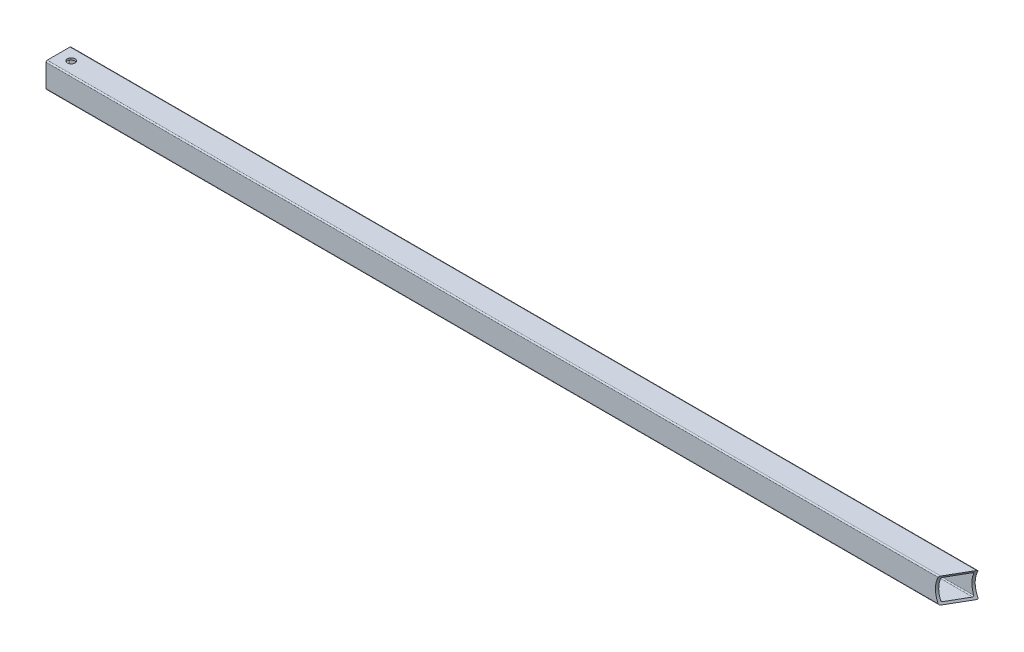
ISO-10303-21;
HEADER;
FILE_DESCRIPTION(('STEP AP214'),'2;1');
FILE_NAME('part.step','',(''),(''),'','','');
FILE_SCHEMA(('AUTOMOTIVE_DESIGN { 1 0 10303 214 1 1 1 1 }'));
ENDSEC;
DATA;
#1=APPLICATION_CONTEXT('core data for automotive mechanical design processes');
#2=APPLICATION_PROTOCOL_DEFINITION('international standard','automotive_design',2000,#1);
#3=PRODUCT_CONTEXT('',#1,'mechanical');
#4=PRODUCT('Part','Part','',(#3));
#5=PRODUCT_RELATED_PRODUCT_CATEGORY('part','',(#4));
#6=PRODUCT_DEFINITION_FORMATION('','',#4);
#7=PRODUCT_DEFINITION_CONTEXT('part definition',#1,'design');
#8=PRODUCT_DEFINITION('design','',#6,#7);
#9=PRODUCT_DEFINITION_SHAPE('','',#8);
#10=(LENGTH_UNIT() NAMED_UNIT(*) SI_UNIT(.MILLI.,.METRE.));
#11=(NAMED_UNIT(*) PLANE_ANGLE_UNIT() SI_UNIT($,.RADIAN.));
#12=(NAMED_UNIT(*) SI_UNIT($,.STERADIAN.) SOLID_ANGLE_UNIT());
#13=UNCERTAINTY_MEASURE_WITH_UNIT(LENGTH_MEASURE(1.E-05),#10,'distance_accuracy_value','');
#14=(GEOMETRIC_REPRESENTATION_CONTEXT(3) GLOBAL_UNCERTAINTY_ASSIGNED_CONTEXT((#13)) GLOBAL_UNIT_ASSIGNED_CONTEXT((#10,
#11,#12)) REPRESENTATION_CONTEXT('',''));
#15=CARTESIAN_POINT('',(0.,0.,0.));
#16=DIRECTION('',(0.,0.,1.));
#17=DIRECTION('',(1.,0.,0.));
#18=AXIS2_PLACEMENT_3D('',#15,#16,#17);
#19=CARTESIAN_POINT('',(457.2,-11.43,-11.43));
#20=DIRECTION('',(-1.,0.,0.));
#21=DIRECTION('',(0.,0.,1.));
#22=AXIS2_PLACEMENT_3D('',#19,#20,#21);
#23=CYLINDRICAL_SURFACE('',#22,1.27);
#24=DIRECTION('',(-1.,0.,0.));
#25=VECTOR('',#24,1.);
#26=CARTESIAN_POINT('',(457.2,-11.43,-12.7));
#27=LINE('',#26,#25);
#28=CARTESIAN_POINT('',(456.516703940509,-11.43,-12.7));
#29=VERTEX_POINT('',#28);
#30=CARTESIAN_POINT('',(-457.2,-11.43,-12.7));
#31=VERTEX_POINT('',#30);
#32=EDGE_CURVE('E11',#29,#31,#27,.T.);
#33=ORIENTED_EDGE('',*,*,#32,.F.);
#34=CARTESIAN_POINT('',(456.51670394051,-11.43,-12.7));
#35=CARTESIAN_POINT('',(456.548055928662,-11.4921896979992,-12.7000400487077));
#36=CARTESIAN_POINT('',(456.577605739151,-11.5554827073413,-12.6954281215397));
#37=CARTESIAN_POINT('',(456.632090513618,-11.68308710355,-12.6762017861905));
#38=CARTESIAN_POINT('',(456.656988642404,-11.7474025748919,-12.6615115165696));
#39=CARTESIAN_POINT('',(456.700756992172,-11.8751934629432,-12.62130655093));
#40=CARTESIAN_POINT('',(456.719595567676,-11.9386628615714,-12.5957365982791));
#41=CARTESIAN_POINT('',(456.749660927176,-12.0618369918309,-12.5338140681127));
#42=CARTESIAN_POINT('',(456.760914620371,-12.1215543434283,-12.4975002740865));
#43=CARTESIAN_POINT('',(456.774040350491,-12.2281912218469,-12.419760934377));
#44=CARTESIAN_POINT('',(456.776853765989,-12.2757910041287,-12.3794260856591));
#45=CARTESIAN_POINT('',(456.775468136961,-12.3645149981887,-12.2922335225601));
#46=CARTESIAN_POINT('',(456.771267357041,-12.4056376046836,-12.2453741965767));
#47=CARTESIAN_POINT('',(456.756652640083,-12.477041332381,-12.1509834596496));
#48=CARTESIAN_POINT('',(456.746781917942,-12.5079381784875,-12.1038289154138));
#49=CARTESIAN_POINT('',(456.721749904562,-12.5627444180756,-12.0069638161415));
#50=CARTESIAN_POINT('',(456.706588748937,-12.5866539906397,-11.9572533266518));
#51=CARTESIAN_POINT('',(456.67066129677,-12.628571893546,-11.8538095328422));
#52=CARTESIAN_POINT('',(456.649629077576,-12.6461756951545,-11.8000066776297));
#53=CARTESIAN_POINT('',(456.603255214652,-12.6738558920262,-11.6923259813222));
#54=CARTESIAN_POINT('',(456.57791202246,-12.6839295754989,-11.6384481202068));
#55=CARTESIAN_POINT('',(456.537587324407,-12.6937171627392,-11.5589003723649));
#56=CARTESIAN_POINT('',(456.523911105872,-12.6960943778922,-11.5328545674296));
#57=CARTESIAN_POINT('',(456.495853942387,-12.699232879202,-11.4811444979444));
#58=CARTESIAN_POINT('',(456.481475173879,-12.6999988677535,-11.4554793407793));
#59=CARTESIAN_POINT('',(456.466765158129,-12.7000000000004,-11.43));
#60=B_SPLINE_CURVE_WITH_KNOTS('',3,(#34,#35,#36,#37,#38,#39,#40,#41,#42,#43,#44,#45,#46,#47,#48,
#49,#50,#51,#52,#53,#54,#55,#56,#57,#58,#59),.UNSPECIFIED.,.F.,.F.,(4,2,2,2,2,2,2,2,2,2,2,2,4),
(0.,0.209018302451343,0.419627437172249,0.631319244751945,0.84225601469521,1.02858264310135,
1.21495537771266,1.38589737755083,1.55683499579308,1.73732675938144,1.91788349145034,
2.00637980771887,2.09461748543629),.UNSPECIFIED.);
#61=CARTESIAN_POINT('',(456.46676515813,-12.7,-11.4300000000008));
#62=VERTEX_POINT('',#61);
#63=EDGE_CURVE('E157',#29,#62,#60,.T.);
#64=ORIENTED_EDGE('',*,*,#63,.T.);
#65=DIRECTION('',(-1.,0.,0.));
#66=VECTOR('',#65,1.);
#67=CARTESIAN_POINT('',(457.2,-12.7,-11.43));
#68=LINE('',#67,#66);
#69=CARTESIAN_POINT('',(-457.2,-12.7,-11.43));
#70=VERTEX_POINT('',#69);
#71=EDGE_CURVE('E169',#62,#70,#68,.T.);
#72=ORIENTED_EDGE('',*,*,#71,.T.);
#73=CARTESIAN_POINT('',(-457.2,-11.43,-11.43));
#74=DIRECTION('',(1.,0.,0.));
#75=DIRECTION('',(0.,0.,-1.));
#76=AXIS2_PLACEMENT_3D('',#73,#74,#75);
#77=CIRCLE('',#76,1.27);
#78=EDGE_CURVE('E214',#70,#31,#77,.T.);
#79=ORIENTED_EDGE('',*,*,#78,.T.);
#80=EDGE_LOOP('',(#33,#64,#72,#79));
#81=FACE_BOUND('',#80,.T.);
#82=ADVANCED_FACE('F42',(#81),#23,.T.);
#83=CARTESIAN_POINT('',(457.2,-11.43,-12.7));
#84=DIRECTION('',(0.,0.,1.));
#85=DIRECTION('',(1.,0.,0.));
#86=AXIS2_PLACEMENT_3D('',#83,#84,#85);
#87=PLANE('',#86);
#88=DIRECTION('',(-1.,0.,0.));
#89=VECTOR('',#88,1.);
#90=CARTESIAN_POINT('',(457.2,11.43,-12.7));
#91=LINE('',#90,#89);
#92=CARTESIAN_POINT('',(456.51670394051,11.43,-12.7));
#93=VERTEX_POINT('',#92);
#94=CARTESIAN_POINT('',(-457.2,11.43,-12.7));
#95=VERTEX_POINT('',#94);
#96=EDGE_CURVE('E51',#93,#95,#91,.T.);
#97=ORIENTED_EDGE('',*,*,#96,.F.);
#98=CARTESIAN_POINT('',(486.757641425978,0.,-12.6999999999999));
#99=DIRECTION('',(0.,0.,1.));
#100=DIRECTION('',(-1.,0.,0.));
#101=AXIS2_PLACEMENT_3D('',#98,#99,#100);
#102=ELLIPSE('',#101,32.9955678841872,28.5749999999999);
#103=EDGE_CURVE('E171',#93,#29,#102,.T.);
#104=ORIENTED_EDGE('',*,*,#103,.T.);
#105=ORIENTED_EDGE('',*,*,#32,.T.);
#106=DIRECTION('',(0.,1.,0.));
#107=VECTOR('',#106,1.);
#108=CARTESIAN_POINT('',(-457.2,-11.43,-12.7));
#109=LINE('',#108,#107);
#110=EDGE_CURVE('E208',#31,#95,#109,.T.);
#111=ORIENTED_EDGE('',*,*,#110,.T.);
#112=EDGE_LOOP('',(#97,#104,#105,#111));
#113=FACE_BOUND('',#112,.T.);
#114=ADVANCED_FACE('F213',(#113),#87,.F.);
#115=CARTESIAN_POINT('',(457.2,11.43,-11.43));
#116=DIRECTION('',(-1.,0.,0.));
#117=DIRECTION('',(0.,0.,1.));
#118=AXIS2_PLACEMENT_3D('',#115,#116,#117);
#119=CYLINDRICAL_SURFACE('',#118,1.27);
#120=DIRECTION('',(-1.,0.,0.));
#121=VECTOR('',#120,1.);
#122=CARTESIAN_POINT('',(457.2,12.7,-11.43));
#123=LINE('',#122,#121);
#124=CARTESIAN_POINT('',(456.46676515813,12.7,-11.4300000000008));
#125=VERTEX_POINT('',#124);
#126=CARTESIAN_POINT('',(-457.2,12.7,-11.43));
#127=VERTEX_POINT('',#126);
#128=EDGE_CURVE('E191',#125,#127,#123,.T.);
#129=ORIENTED_EDGE('',*,*,#128,.F.);
#130=CARTESIAN_POINT('',(456.466765158129,12.7,-11.43));
#131=CARTESIAN_POINT('',(456.502351927012,12.7000317856708,-11.491589239129));
#132=CARTESIAN_POINT('',(456.53607472363,12.6955140371332,-11.5544975477733));
#133=CARTESIAN_POINT('',(456.598695050086,12.6764480993987,-11.681861682088));
#134=CARTESIAN_POINT('',(456.627547107976,12.6618112614634,-11.7463262862849));
#135=CARTESIAN_POINT('',(456.678802395542,12.6214221680008,-11.8749488625096));
#136=CARTESIAN_POINT('',(456.70116549296,12.5956031021339,-11.9391026101252));
#137=CARTESIAN_POINT('',(456.737649873101,12.5326930836253,-12.0638902200221));
#138=CARTESIAN_POINT('',(456.751805285975,12.4956497985754,-12.1245377004662));
#139=CARTESIAN_POINT('',(456.769668455544,12.4168024895119,-12.2318349449494));
#140=CARTESIAN_POINT('',(456.774531468795,12.3763225419752,-12.279268082083));
#141=CARTESIAN_POINT('',(456.777220229131,12.2886789733655,-12.367788023975));
#142=CARTESIAN_POINT('',(456.775043058859,12.2415125892681,-12.4088721904165));
#143=CARTESIAN_POINT('',(456.764410704742,12.1464130799932,-12.4801840912052));
#144=CARTESIAN_POINT('',(456.756501773879,12.0988818073209,-12.5110359695691));
#145=CARTESIAN_POINT('',(456.735555644032,12.0010412202813,-12.5657614694475));
#146=CARTESIAN_POINT('',(456.722518496917,11.9507319340163,-12.5896351615375));
#147=CARTESIAN_POINT('',(456.691087600913,11.8456371577934,-12.6314713040469));
#148=CARTESIAN_POINT('',(456.672423278696,11.7907626663939,-12.6490020785816));
#149=CARTESIAN_POINT('',(456.630928050299,11.6806752981132,-12.6763059378159));
#150=CARTESIAN_POINT('',(456.608096830798,11.6254623960879,-12.6860784388559));
#151=CARTESIAN_POINT('',(456.573020246133,11.5469941550227,-12.6948242044156));
#152=CARTESIAN_POINT('',(456.562135334623,11.5234145990368,-12.6967784456287));
#153=CARTESIAN_POINT('',(456.539820883164,11.4765154917477,-12.6993642116898));
#154=CARTESIAN_POINT('',(456.528392818027,11.4531954272289,-12.6999991300556));
#155=CARTESIAN_POINT('',(456.516703940509,11.4300000000001,-12.7));
#156=B_SPLINE_CURVE_WITH_KNOTS('',3,(#130,#131,#132,#133,#134,#135,#136,#137,#138,#139,#140,
#141,#142,#143,#144,#145,#146,#147,#148,#149,#150,#151,#152,#153,#154,#155),.UNSPECIFIED.,.F.,
.F.,(4,2,2,2,2,2,2,2,2,2,2,2,4),(0.,0.213536060152326,0.428966918502101,0.645703059905118,
0.861531357901509,1.04813136942274,1.23480871533046,1.40570577815031,1.57660111250416,
1.75757551807397,1.93856353716848,2.01666412177443,2.0945635687544),.UNSPECIFIED.);
#157=EDGE_CURVE('E201',#125,#93,#156,.T.);
#158=ORIENTED_EDGE('',*,*,#157,.T.);
#159=ORIENTED_EDGE('',*,*,#96,.T.);
#160=CARTESIAN_POINT('',(-457.2,11.43,-11.43));
#161=DIRECTION('',(1.,0.,0.));
#162=DIRECTION('',(0.,0.,-1.));
#163=AXIS2_PLACEMENT_3D('',#160,#161,#162);
#164=CIRCLE('',#163,1.27);
#165=EDGE_CURVE('E200',#95,#127,#164,.T.);
#166=ORIENTED_EDGE('',*,*,#165,.T.);
#167=EDGE_LOOP('',(#129,#158,#159,#166));
#168=FACE_BOUND('',#167,.T.);
#169=ADVANCED_FACE('F199',(#168),#119,.T.);
#170=CARTESIAN_POINT('',(457.2,12.7,-11.43));
#171=DIRECTION('',(0.,-1.,0.));
#172=DIRECTION('',(0.,0.,-1.));
#173=AXIS2_PLACEMENT_3D('',#170,#171,#172);
#174=PLANE('',#173);
#175=CARTESIAN_POINT('',(-444.5,12.7,0.));
#176=DIRECTION('',(0.,1.,0.));
#177=DIRECTION('',(0.,0.,1.));
#178=AXIS2_PLACEMENT_3D('',#175,#176,#177);
#179=CIRCLE('',#178,3.80999999999999);
#180=CARTESIAN_POINT('',(-444.5,12.7,3.80999999999999));
#181=VERTEX_POINT('',#180);
#182=EDGE_CURVE('E163',#181,#181,#179,.T.);
#183=ORIENTED_EDGE('',*,*,#182,.F.);
#184=EDGE_LOOP('',(#183));
#185=FACE_BOUND('',#184,.T.);
#186=DIRECTION('',(-1.,0.,0.));
#187=VECTOR('',#186,1.);
#188=CARTESIAN_POINT('',(457.2,12.7,11.43));
#189=LINE('',#188,#187);
#190=CARTESIAN_POINT('',(443.268538004455,12.7,11.4299999999992));
#191=VERTEX_POINT('',#190);
#192=CARTESIAN_POINT('',(-457.2,12.7,11.43));
#193=VERTEX_POINT('',#192);
#194=EDGE_CURVE('E189',#191,#193,#189,.T.);
#195=ORIENTED_EDGE('',*,*,#194,.F.);
#196=DIRECTION('',(-0.500000000000005,0.,0.866025403784436));
#197=VECTOR('',#196,1.);
#198=CARTESIAN_POINT('',(457.2,12.7,-12.7));
#199=LINE('',#198,#197);
#200=EDGE_CURVE('E164',#125,#191,#199,.T.);
#201=ORIENTED_EDGE('',*,*,#200,.F.);
#202=ORIENTED_EDGE('',*,*,#128,.T.);
#203=DIRECTION('',(0.,0.,1.));
#204=VECTOR('',#203,1.);
#205=CARTESIAN_POINT('',(-457.2,12.7,-11.43));
#206=LINE('',#205,#204);
#207=EDGE_CURVE('E211',#127,#193,#206,.T.);
#208=ORIENTED_EDGE('',*,*,#207,.T.);
#209=EDGE_LOOP('',(#195,#201,#202,#208));
#210=FACE_BOUND('',#209,.T.);
#211=ADVANCED_FACE('F364',(#185,#210),#174,.F.);
#212=CARTESIAN_POINT('',(457.2,11.43,11.43));
#213=DIRECTION('',(-1.,0.,0.));
#214=DIRECTION('',(0.,0.,1.));
#215=AXIS2_PLACEMENT_3D('',#212,#213,#214);
#216=CYLINDRICAL_SURFACE('',#215,1.27);
#217=DIRECTION('',(-1.,0.,0.));
#218=VECTOR('',#217,1.);
#219=CARTESIAN_POINT('',(457.2,11.43,12.7));
#220=LINE('',#219,#218);
#221=CARTESIAN_POINT('',(441.852007103093,11.43,12.7));
#222=VERTEX_POINT('',#221);
#223=CARTESIAN_POINT('',(-457.2,11.43,12.7));
#224=VERTEX_POINT('',#223);
#225=EDGE_CURVE('E187',#222,#224,#220,.T.);
#226=ORIENTED_EDGE('',*,*,#225,.F.);
#227=CARTESIAN_POINT('',(441.852007103093,11.43,12.7));
#228=CARTESIAN_POINT('',(441.87257486327,11.4708094567252,12.6999959166934));
#229=CARTESIAN_POINT('',(441.8941281906,11.5110682230736,12.6980334906639));
#230=CARTESIAN_POINT('',(441.938891383439,11.5902380841285,12.6904781788199));
#231=CARTESIAN_POINT('',(441.962099013226,11.629150895972,12.6848901131133));
#232=CARTESIAN_POINT('',(442.033488189129,11.7431342471614,12.6632077613086));
#233=CARTESIAN_POINT('',(442.083728231018,11.8160187495146,12.6421871216464));
#234=CARTESIAN_POINT('',(442.187440173166,11.9543293541725,12.5890712768413));
#235=CARTESIAN_POINT('',(442.240893863996,12.019792350138,12.5570343640042));
#236=CARTESIAN_POINT('',(442.349983118572,12.1432336122389,12.4832691362784));
#237=CARTESIAN_POINT('',(442.405623165774,12.201195326254,12.4415199394495));
#238=CARTESIAN_POINT('',(442.529315587016,12.3199545888963,12.340040244569));
#239=CARTESIAN_POINT('',(442.597573226292,12.3788956533172,12.2783780080256));
#240=CARTESIAN_POINT('',(442.733526929121,12.4836496324868,12.1441239528254));
#241=CARTESIAN_POINT('',(442.801222684751,12.5294557579323,12.0715265113468));
#242=CARTESIAN_POINT('',(442.928013014012,12.6027474216968,11.9237059007328));
#243=CARTESIAN_POINT('',(442.987332509049,12.6315131577994,11.8493107929145));
#244=CARTESIAN_POINT('',(443.101880266141,12.6749123707245,11.6937721525839));
#245=CARTESIAN_POINT('',(443.157122297943,12.6895956296686,11.6126535015462));
#246=CARTESIAN_POINT('',(443.229466106718,12.6986862399746,11.4963719613201));
#247=CARTESIAN_POINT('',(443.24928378171,12.6999977768955,11.4633496113822));
#248=CARTESIAN_POINT('',(443.268538004454,12.7,11.4299999999998));
#249=B_SPLINE_CURVE_WITH_KNOTS('',3,(#227,#228,#229,#230,#231,#232,#233,#234,#235,#236,#237,
#238,#239,#240,#241,#242,#243,#244,#245,#246,#247,#248),.UNSPECIFIED.,.F.,.F.,(4,2,2,2,2,2,2,2,
2,2,4),(0.,0.136963726066388,0.273745737733625,0.545417313873356,0.815672922216604,
1.0865150547251,1.41290556141949,1.73946447285937,2.03655603725899,2.33259345728007,
2.44810780351783),.UNSPECIFIED.);
#250=EDGE_CURVE('E348',#222,#191,#249,.T.);
#251=ORIENTED_EDGE('',*,*,#250,.T.);
#252=ORIENTED_EDGE('',*,*,#194,.T.);
#253=CARTESIAN_POINT('',(-457.2,11.43,11.43));
#254=DIRECTION('',(1.,0.,0.));
#255=DIRECTION('',(0.,0.,-1.));
#256=AXIS2_PLACEMENT_3D('',#253,#254,#255);
#257=CIRCLE('',#256,1.27);
#258=EDGE_CURVE('E221',#193,#224,#257,.T.);
#259=ORIENTED_EDGE('',*,*,#258,.T.);
#260=EDGE_LOOP('',(#226,#251,#252,#259));
#261=FACE_BOUND('',#260,.T.);
#262=ADVANCED_FACE('F395',(#261),#216,.T.);
#263=CARTESIAN_POINT('',(457.2,-11.43,12.7));
#264=DIRECTION('',(0.,0.,-1.));
#265=DIRECTION('',(-1.,0.,0.));
#266=AXIS2_PLACEMENT_3D('',#263,#264,#265);
#267=PLANE('',#266);
#268=DIRECTION('',(-1.,0.,0.));
#269=VECTOR('',#268,1.);
#270=CARTESIAN_POINT('',(457.2,-11.43,12.7));
#271=LINE('',#270,#269);
#272=CARTESIAN_POINT('',(441.852007103093,-11.43,12.7));
#273=VERTEX_POINT('',#272);
#274=CARTESIAN_POINT('',(-457.2,-11.43,12.7));
#275=VERTEX_POINT('',#274);
#276=EDGE_CURVE('E180',#273,#275,#271,.T.);
#277=ORIENTED_EDGE('',*,*,#276,.F.);
#278=CARTESIAN_POINT('',(472.092944588561,0.,12.6999999999998));
#279=DIRECTION('',(0.,0.,-1.));
#280=DIRECTION('',(-1.,0.,0.));
#281=AXIS2_PLACEMENT_3D('',#278,#279,#280);
#282=ELLIPSE('',#281,32.9955678841872,28.5749999999999);
#283=EDGE_CURVE('E58',#273,#222,#282,.T.);
#284=ORIENTED_EDGE('',*,*,#283,.T.);
#285=ORIENTED_EDGE('',*,*,#225,.T.);
#286=DIRECTION('',(0.,-1.,0.));
#287=VECTOR('',#286,1.);
#288=CARTESIAN_POINT('',(-457.2,-11.43,12.7));
#289=LINE('',#288,#287);
#290=EDGE_CURVE('E224',#224,#275,#289,.T.);
#291=ORIENTED_EDGE('',*,*,#290,.T.);
#292=EDGE_LOOP('',(#277,#284,#285,#291));
#293=FACE_BOUND('',#292,.T.);
#294=ADVANCED_FACE('F404',(#293),#267,.F.);
#295=CARTESIAN_POINT('',(457.2,-11.43,11.43));
#296=DIRECTION('',(-1.,0.,0.));
#297=DIRECTION('',(0.,0.,1.));
#298=AXIS2_PLACEMENT_3D('',#295,#296,#297);
#299=CYLINDRICAL_SURFACE('',#298,1.27);
#300=DIRECTION('',(-1.,0.,0.));
#301=VECTOR('',#300,1.);
#302=CARTESIAN_POINT('',(457.2,-12.7,11.43));
#303=LINE('',#302,#301);
#304=CARTESIAN_POINT('',(443.268538004455,-12.7,11.4299999999992));
#305=VERTEX_POINT('',#304);
#306=CARTESIAN_POINT('',(-457.2,-12.7,11.43));
#307=VERTEX_POINT('',#306);
#308=EDGE_CURVE('E177',#305,#307,#303,.T.);
#309=ORIENTED_EDGE('',*,*,#308,.F.);
#310=CARTESIAN_POINT('',(443.268538004455,-12.7,11.43));
#311=CARTESIAN_POINT('',(443.241262622737,-12.6999900467042,11.4772353004336));
#312=CARTESIAN_POINT('',(443.212897001908,-12.6973657867599,11.5237588807889));
#313=CARTESIAN_POINT('',(443.154409664112,-12.687284191627,11.6150644949346));
#314=CARTESIAN_POINT('',(443.124290455596,-12.6798336129058,11.6598488707166));
#315=CARTESIAN_POINT('',(443.032314096323,-12.6509779838043,11.790606947275));
#316=CARTESIAN_POINT('',(442.968387084005,-12.6230557281226,11.8737530294241));
#317=CARTESIAN_POINT('',(442.844226296556,-12.5558194731577,12.0228230841466));
#318=CARTESIAN_POINT('',(442.78426293101,-12.5179247353692,12.0896378368333));
#319=CARTESIAN_POINT('',(442.66323126705,-12.4311816067507,12.2150886832636));
#320=CARTESIAN_POINT('',(442.602160125838,-12.3822997150246,12.2736988542281));
#321=CARTESIAN_POINT('',(442.469309291427,-12.2647470827716,12.3913659921351));
#322=CARTESIAN_POINT('',(442.397610235782,-12.1940927993176,12.4485507914164));
#323=CARTESIAN_POINT('',(442.257392589632,-12.0403556925109,12.5474481430115));
#324=CARTESIAN_POINT('',(442.188864075871,-11.9573156484336,12.5892122957022));
#325=CARTESIAN_POINT('',(442.073613775043,-11.8015087631059,12.6465496711984));
#326=CARTESIAN_POINT('',(442.02563154933,-11.7311281330323,12.6660170495411));
#327=CARTESIAN_POINT('',(441.957397222534,-11.6213183095627,12.6860623084392));
#328=CARTESIAN_POINT('',(441.935217717494,-11.5838956416361,12.6912195954289));
#329=CARTESIAN_POINT('',(441.892389567089,-11.5078173372809,12.6981892473155));
#330=CARTESIAN_POINT('',(441.871743066937,-11.4691600774445,12.6999970066769));
#331=CARTESIAN_POINT('',(441.852007103093,-11.4300000000002,12.7));
#332=B_SPLINE_CURVE_WITH_KNOTS('',3,(#310,#311,#312,#313,#314,#315,#316,#317,#318,#319,#320,
#321,#322,#323,#324,#325,#326,#327,#328,#329,#330,#331),.UNSPECIFIED.,.F.,.F.,(4,2,2,2,2,2,2,2,
2,2,4),(0.,0.163439145736498,0.326649982525089,0.650443502810207,0.941841182025639,
1.23413971314347,1.57980536900236,1.9243036491199,2.18532785561987,2.31659131660828,
2.44803512875806),.UNSPECIFIED.);
#333=EDGE_CURVE('E159',#305,#273,#332,.T.);
#334=ORIENTED_EDGE('',*,*,#333,.T.);
#335=ORIENTED_EDGE('',*,*,#276,.T.);
#336=CARTESIAN_POINT('',(-457.2,-11.43,11.43));
#337=DIRECTION('',(1.,0.,0.));
#338=DIRECTION('',(0.,0.,-1.));
#339=AXIS2_PLACEMENT_3D('',#336,#337,#338);
#340=CIRCLE('',#339,1.27);
#341=EDGE_CURVE('E227',#275,#307,#340,.T.);
#342=ORIENTED_EDGE('',*,*,#341,.T.);
#343=EDGE_LOOP('',(#309,#334,#335,#342));
#344=FACE_BOUND('',#343,.T.);
#345=ADVANCED_FACE('F413',(#344),#299,.T.);
#346=CARTESIAN_POINT('',(457.2,-12.7,-11.43));
#347=DIRECTION('',(0.,1.,0.));
#348=DIRECTION('',(0.,0.,1.));
#349=AXIS2_PLACEMENT_3D('',#346,#347,#348);
#350=PLANE('',#349);
#351=CARTESIAN_POINT('',(-444.5,-12.7,0.));
#352=DIRECTION('',(0.,1.,0.));
#353=DIRECTION('',(0.,0.,1.));
#354=AXIS2_PLACEMENT_3D('',#351,#352,#353);
#355=CIRCLE('',#354,3.80999999999999);
#356=CARTESIAN_POINT('',(-444.5,-12.7,3.80999999999998));
#357=VERTEX_POINT('',#356);
#358=EDGE_CURVE('E579',#357,#357,#355,.T.);
#359=ORIENTED_EDGE('',*,*,#358,.T.);
#360=EDGE_LOOP('',(#359));
#361=FACE_BOUND('',#360,.T.);
#362=ORIENTED_EDGE('',*,*,#71,.F.);
#363=DIRECTION('',(-0.500000000000005,0.,0.866025403784436));
#364=VECTOR('',#363,1.);
#365=CARTESIAN_POINT('',(457.2,-12.7,-12.7));
#366=LINE('',#365,#364);
#367=EDGE_CURVE('E154',#62,#305,#366,.T.);
#368=ORIENTED_EDGE('',*,*,#367,.T.);
#369=ORIENTED_EDGE('',*,*,#308,.T.);
#370=DIRECTION('',(0.,0.,-1.));
#371=VECTOR('',#370,1.);
#372=CARTESIAN_POINT('',(-457.2,-12.7,-11.43));
#373=LINE('',#372,#371);
#374=EDGE_CURVE('E176',#307,#70,#373,.T.);
#375=ORIENTED_EDGE('',*,*,#374,.T.);
#376=EDGE_LOOP('',(#362,#368,#369,#375));
#377=FACE_BOUND('',#376,.T.);
#378=ADVANCED_FACE('F174',(#361,#377),#350,.F.);
#379=CARTESIAN_POINT('',(457.2,9.53261999999999,-9.53262));
#380=DIRECTION('',(-1.,0.,0.));
#381=DIRECTION('',(0.,0.,1.));
#382=AXIS2_PLACEMENT_3D('',#379,#380,#381);
#383=CYLINDRICAL_SURFACE('',#382,1.05918);
#384=CARTESIAN_POINT('',(454.283793204096,10.5918,-9.53261999999999));
#385=CARTESIAN_POINT('',(454.315404661121,10.5918260852537,-9.5873384669669));
#386=CARTESIAN_POINT('',(454.345606232871,10.5875542679611,-9.6430711582324));
#387=CARTESIAN_POINT('',(454.402292322947,10.5696509463283,-9.75553156341762));
#388=CARTESIAN_POINT('',(454.428741208552,10.5559361330041,-9.81226371848614));
#389=CARTESIAN_POINT('',(454.476553594311,10.5182501626599,-9.92497624310967));
#390=CARTESIAN_POINT('',(454.49788729382,10.4942210751587,-9.98095049603676));
#391=CARTESIAN_POINT('',(454.533896091612,10.4357927286653,-10.0893108482503));
#392=CARTESIAN_POINT('',(454.548598022214,10.4014362131405,-10.1417106652635));
#393=CARTESIAN_POINT('',(454.568878739549,10.3285230088569,-10.2335810074842));
#394=CARTESIAN_POINT('',(454.575446167789,10.2912265158847,-10.2738347501139));
#395=CARTESIAN_POINT('',(454.582621464728,10.2105000362708,-10.3483109871169));
#396=CARTESIAN_POINT('',(454.583229010915,10.1670697178337,-10.3825331550004));
#397=CARTESIAN_POINT('',(454.578785609956,10.0803736928924,-10.4405108669542));
#398=CARTESIAN_POINT('',(454.574310916081,10.0375515835193,-10.4649813324227));
#399=CARTESIAN_POINT('',(454.560925627991,9.94949863813327,-10.5075381449197));
#400=CARTESIAN_POINT('',(454.552014140513,9.90426731870992,-10.5256232051147));
#401=CARTESIAN_POINT('',(454.529945566846,9.81144583514968,-10.5556365185374));
#402=CARTESIAN_POINT('',(454.516682487089,9.76382492291818,-10.5673894000557));
#403=CARTESIAN_POINT('',(454.486597340433,9.668591930647,-10.584146421054));
#404=CARTESIAN_POINT('',(454.469779375526,9.62097990319406,-10.5891582903459));
#405=CARTESIAN_POINT('',(454.446140835756,9.56006948612725,-10.5915349255758));
#406=CARTESIAN_POINT('',(454.440661367148,9.54631692825952,-10.5918011300548));
#407=CARTESIAN_POINT('',(454.435064107122,9.53262000000005,-10.5918));
#408=B_SPLINE_CURVE_WITH_KNOTS('',3,(#384,#385,#386,#387,#388,#389,#390,#391,#392,#393,#394,
#395,#396,#397,#398,#399,#400,#401,#402,#403,#404,#405,#406,#407),.UNSPECIFIED.,.F.,.F.,(4,2,2,
2,2,2,2,2,2,2,2,4),(0.,0.189678321555184,0.381051852430399,0.573514600298168,0.765191495972585,
0.930050497660008,1.0949184204459,1.24280870392774,1.39072877435302,1.54255866494322,
1.69421430575201,1.73861840916825),.UNSPECIFIED.);
#409=CARTESIAN_POINT('',(454.283793204096,10.5917999999999,-9.53262000000016));
#410=VERTEX_POINT('',#409);
#411=CARTESIAN_POINT('',(454.435064107122,9.53261999999999,-10.5918));
#412=VERTEX_POINT('',#411);
#413=EDGE_CURVE('E66',#410,#412,#408,.T.);
#414=ORIENTED_EDGE('',*,*,#413,.F.);
#415=DIRECTION('',(-1.,0.,0.));
#416=VECTOR('',#415,1.);
#417=CARTESIAN_POINT('',(457.2,10.5918,-9.53261999999999));
#418=LINE('',#417,#416);
#419=CARTESIAN_POINT('',(-457.2,10.5918,-9.53261999999999));
#420=VERTEX_POINT('',#419);
#421=EDGE_CURVE('E178',#410,#420,#418,.T.);
#422=ORIENTED_EDGE('',*,*,#421,.T.);
#423=CARTESIAN_POINT('',(-457.2,9.53261999999999,-9.53262));
#424=DIRECTION('',(1.,0.,0.));
#425=DIRECTION('',(0.,0.,-1.));
#426=AXIS2_PLACEMENT_3D('',#423,#424,#425);
#427=CIRCLE('',#426,1.05918);
#428=CARTESIAN_POINT('',(-457.2,9.53261999999999,-10.5918));
#429=VERTEX_POINT('',#428);
#430=EDGE_CURVE('E266',#429,#420,#427,.T.);
#431=ORIENTED_EDGE('',*,*,#430,.F.);
#432=DIRECTION('',(-1.,0.,0.));
#433=VECTOR('',#432,1.);
#434=CARTESIAN_POINT('',(457.2,9.53261999999999,-10.5918));
#435=LINE('',#434,#433);
#436=EDGE_CURVE('E231',#412,#429,#435,.T.);
#437=ORIENTED_EDGE('',*,*,#436,.F.);
#438=EDGE_LOOP('',(#414,#422,#431,#437));
#439=FACE_BOUND('',#438,.T.);
#440=ADVANCED_FACE('F288',(#439),#383,.F.);
#441=CARTESIAN_POINT('',(457.2,10.5918,-9.53261999999999));
#442=DIRECTION('',(0.,-1.,0.));
#443=DIRECTION('',(0.,0.,-1.));
#444=AXIS2_PLACEMENT_3D('',#441,#442,#443);
#445=PLANE('',#444);
#446=DIRECTION('',(-0.500000000000004,0.,0.866025403784436));
#447=VECTOR('',#446,1.);
#448=CARTESIAN_POINT('',(1028.32516289999,10.5917999999999,-1003.80143795971));
#449=LINE('',#448,#447);
#450=CARTESIAN_POINT('',(443.276471757931,10.5918,9.53261999999999));
#451=VERTEX_POINT('',#450);
#452=EDGE_CURVE('E252',#451,#410,#449,.F.);
#453=ORIENTED_EDGE('',*,*,#452,.F.);
#454=DIRECTION('',(-1.,0.,0.));
#455=VECTOR('',#454,1.);
#456=CARTESIAN_POINT('',(457.2,10.5918,9.53261999999999));
#457=LINE('',#456,#455);
#458=CARTESIAN_POINT('',(-457.2,10.5918,9.53261999999999));
#459=VERTEX_POINT('',#458);
#460=EDGE_CURVE('E182',#451,#459,#457,.T.);
#461=ORIENTED_EDGE('',*,*,#460,.T.);
#462=DIRECTION('',(0.,0.,1.));
#463=VECTOR('',#462,1.);
#464=CARTESIAN_POINT('',(-457.2,10.5918,-9.53261999999999));
#465=LINE('',#464,#463);
#466=EDGE_CURVE('E249',#420,#459,#465,.T.);
#467=ORIENTED_EDGE('',*,*,#466,.F.);
#468=ORIENTED_EDGE('',*,*,#421,.F.);
#469=EDGE_LOOP('',(#453,#461,#467,#468));
#470=FACE_BOUND('',#469,.T.);
#471=CARTESIAN_POINT('',(-444.5,10.5918,0.));
#472=DIRECTION('',(0.,-1.,0.));
#473=DIRECTION('',(0.,0.,-1.));
#474=AXIS2_PLACEMENT_3D('',#471,#472,#473);
#475=CIRCLE('',#474,3.80999999999999);
#476=CARTESIAN_POINT('',(-444.5,10.5918,-3.80999999999998));
#477=VERTEX_POINT('',#476);
#478=EDGE_CURVE('E268',#477,#477,#475,.T.);
#479=ORIENTED_EDGE('',*,*,#478,.F.);
#480=EDGE_LOOP('',(#479));
#481=FACE_BOUND('',#480,.T.);
#482=ADVANCED_FACE('F246',(#470,#481),#445,.T.);
#483=CARTESIAN_POINT('',(457.2,9.53261999999999,9.53261999999999));
#484=DIRECTION('',(-1.,0.,0.));
#485=DIRECTION('',(0.,0.,1.));
#486=AXIS2_PLACEMENT_3D('',#483,#484,#485);
#487=CYLINDRICAL_SURFACE('',#486,1.05918000000001);
#488=CARTESIAN_POINT('',(442.204706944717,9.53261999999999,10.5918));
#489=CARTESIAN_POINT('',(442.231233967276,9.59753690195782,10.5917873054445));
#490=CARTESIAN_POINT('',(442.26085741989,9.66087459234473,10.5858437304543));
#491=CARTESIAN_POINT('',(442.324619566356,9.78284460748146,10.5636713840554));
#492=CARTESIAN_POINT('',(442.358727506367,9.84150496235519,10.5475100414119));
#493=CARTESIAN_POINT('',(442.429995603166,9.95318412162591,10.5065369261697));
#494=CARTESIAN_POINT('',(442.467140432524,10.0062284899414,10.4817667637702));
#495=CARTESIAN_POINT('',(442.543614260717,10.1065126352201,10.4247202297989));
#496=CARTESIAN_POINT('',(442.58294719392,10.1537414311935,10.3924299812148));
#497=CARTESIAN_POINT('',(442.670128516981,10.2498578083299,10.3148667158977));
#498=CARTESIAN_POINT('',(442.718223125119,10.2974809262996,10.2683002633868));
#499=CARTESIAN_POINT('',(442.814886651487,10.3831216940993,10.167360365782));
#500=CARTESIAN_POINT('',(442.863456053901,10.4211281723035,10.1129779548122));
#501=CARTESIAN_POINT('',(442.965025000688,10.4901509361089,9.99131965001287));
#502=CARTESIAN_POINT('',(443.017936853222,10.5199698923701,9.92328564603003));
#503=CARTESIAN_POINT('',(443.12089158877,10.5650262255493,9.78073009409265));
#504=CARTESIAN_POINT('',(443.170943403256,10.5803116258371,9.70623080631713));
#505=CARTESIAN_POINT('',(443.238274456352,10.5902924054465,9.59757743003615));
#506=CARTESIAN_POINT('',(443.257633808319,10.5917979608878,9.56524945818658));
#507=CARTESIAN_POINT('',(443.276471757931,10.5918,9.53261999999987));
#508=B_SPLINE_CURVE_WITH_KNOTS('',3,(#488,#489,#490,#491,#492,#493,#494,#495,#496,#497,#498,
#499,#500,#501,#502,#503,#504,#505,#506,#507),.UNSPECIFIED.,.F.,.F.,(4,2,2,2,2,2,2,2,2,4),(0.,
0.209635225371904,0.417901269879062,0.625174360076866,0.832833010603676,1.07831166866466,
1.3240742027422,1.59636422855063,1.86775136452788,1.98076896303617),.UNSPECIFIED.);
#509=CARTESIAN_POINT('',(442.204706944717,9.53261999999999,10.5918));
#510=VERTEX_POINT('',#509);
#511=EDGE_CURVE('E291',#510,#451,#508,.T.);
#512=ORIENTED_EDGE('',*,*,#511,.F.);
#513=DIRECTION('',(-1.,0.,0.));
#514=VECTOR('',#513,1.);
#515=CARTESIAN_POINT('',(457.2,9.53261999999999,10.5918));
#516=LINE('',#515,#514);
#517=CARTESIAN_POINT('',(-457.2,9.53261999999999,10.5918));
#518=VERTEX_POINT('',#517);
#519=EDGE_CURVE('E241',#510,#518,#516,.T.);
#520=ORIENTED_EDGE('',*,*,#519,.T.);
#521=CARTESIAN_POINT('',(-457.2,9.53261999999999,9.53261999999999));
#522=DIRECTION('',(1.,0.,0.));
#523=DIRECTION('',(0.,0.,-1.));
#524=AXIS2_PLACEMENT_3D('',#521,#522,#523);
#525=CIRCLE('',#524,1.05918000000001);
#526=EDGE_CURVE('E256',#459,#518,#525,.T.);
#527=ORIENTED_EDGE('',*,*,#526,.F.);
#528=ORIENTED_EDGE('',*,*,#460,.F.);
#529=EDGE_LOOP('',(#512,#520,#527,#528));
#530=FACE_BOUND('',#529,.T.);
#531=ADVANCED_FACE('F257',(#530),#487,.F.);
#532=CARTESIAN_POINT('',(457.2,9.53261999999999,10.5918));
#533=DIRECTION('',(0.,0.,-1.));
#534=DIRECTION('',(0.,1.,0.));
#535=AXIS2_PLACEMENT_3D('',#532,#533,#534);
#536=PLANE('',#535);
#537=CARTESIAN_POINT('',(473.310114426067,0.,10.5917999999999));
#538=DIRECTION('',(0.,0.,-1.));
#539=DIRECTION('',(-1.,0.,0.));
#540=AXIS2_PLACEMENT_3D('',#537,#538,#539);
#541=ELLIPSE('',#540,32.9955678841872,28.5749999999999);
#542=CARTESIAN_POINT('',(442.204706944717,-9.53261999999999,10.5918));
#543=VERTEX_POINT('',#542);
#544=EDGE_CURVE('E294',#543,#510,#541,.T.);
#545=ORIENTED_EDGE('',*,*,#544,.F.);
#546=DIRECTION('',(-1.,0.,0.));
#547=VECTOR('',#546,1.);
#548=CARTESIAN_POINT('',(457.2,-9.53261999999999,10.5918));
#549=LINE('',#548,#547);
#550=CARTESIAN_POINT('',(-457.2,-9.53261999999999,10.5918));
#551=VERTEX_POINT('',#550);
#552=EDGE_CURVE('E239',#543,#551,#549,.T.);
#553=ORIENTED_EDGE('',*,*,#552,.T.);
#554=DIRECTION('',(0.,-1.,0.));
#555=VECTOR('',#554,1.);
#556=CARTESIAN_POINT('',(-457.2,9.53261999999999,10.5918));
#557=LINE('',#556,#555);
#558=EDGE_CURVE('E262',#518,#551,#557,.T.);
#559=ORIENTED_EDGE('',*,*,#558,.F.);
#560=ORIENTED_EDGE('',*,*,#519,.F.);
#561=EDGE_LOOP('',(#545,#553,#559,#560));
#562=FACE_BOUND('',#561,.T.);
#563=ADVANCED_FACE('F453',(#562),#536,.T.);
#564=CARTESIAN_POINT('',(457.2,-9.53261999999999,9.53261999999999));
#565=DIRECTION('',(-1.,0.,0.));
#566=DIRECTION('',(0.,0.,1.));
#567=AXIS2_PLACEMENT_3D('',#564,#565,#566);
#568=CYLINDRICAL_SURFACE('',#567,1.05918);
#569=CARTESIAN_POINT('',(443.276471757931,-10.5918,9.53261999999999));
#570=CARTESIAN_POINT('',(443.253769575905,-10.5917926793007,9.5719372927671));
#571=CARTESIAN_POINT('',(443.2303397957,-10.5896111615861,9.61077559760559));
#572=CARTESIAN_POINT('',(443.182314423174,-10.5811630897802,9.68721877853003));
#573=CARTESIAN_POINT('',(443.157720031141,-10.5749006601492,9.72482485972865));
#574=CARTESIAN_POINT('',(443.082864154182,-10.5504811273568,9.83504045554326));
#575=CARTESIAN_POINT('',(443.031240637605,-10.5266848990093,9.90554260274074));
#576=CARTESIAN_POINT('',(442.931359281372,-10.468667086608,10.0327171424456));
#577=CARTESIAN_POINT('',(442.883245279732,-10.4356452661681,10.0900669133441));
#578=CARTESIAN_POINT('',(442.786746071769,-10.359549535703,10.1977545697268));
#579=CARTESIAN_POINT('',(442.738360486841,-10.316450247984,10.2480742318495));
#580=CARTESIAN_POINT('',(442.637177174567,-10.2155412244827,10.3456119137406));
#581=CARTESIAN_POINT('',(442.584508248862,-10.1566124428864,10.3918158712291));
#582=CARTESIAN_POINT('',(442.482596108714,-10.0284773016505,10.4715859002885));
#583=CARTESIAN_POINT('',(442.433340902867,-9.95930990747873,10.5051982506323));
#584=CARTESIAN_POINT('',(442.352677087331,-9.83123799881553,10.5504682958464));
#585=CARTESIAN_POINT('',(442.319969804945,-9.77437966285448,10.5655686617839));
#586=CARTESIAN_POINT('',(442.258768507853,-9.65639572297383,10.5862554059842));
#587=CARTESIAN_POINT('',(442.230300662397,-9.59524678669768,10.5917847627832));
#588=CARTESIAN_POINT('',(442.204706944717,-9.5326200000002,10.5918));
#589=B_SPLINE_CURVE_WITH_KNOTS('',3,(#569,#570,#571,#572,#573,#574,#575,#576,#577,#578,#579,
#580,#581,#582,#583,#584,#585,#586,#587,#588),.UNSPECIFIED.,.F.,.F.,(4,2,2,2,2,2,2,2,2,4),(0.,
0.136056113054533,0.271974930931729,0.54211860980304,0.786696405389817,1.03189687439036,
1.3051597319515,1.57740815816964,1.77846257523653,1.98071074907038),.UNSPECIFIED.);
#590=CARTESIAN_POINT('',(443.276471757931,-10.5918,9.53261999999983));
#591=VERTEX_POINT('',#590);
#592=EDGE_CURVE('E338',#591,#543,#589,.T.);
#593=ORIENTED_EDGE('',*,*,#592,.F.);
#594=DIRECTION('',(-1.,0.,0.));
#595=VECTOR('',#594,1.);
#596=CARTESIAN_POINT('',(457.2,-10.5918,9.53261999999999));
#597=LINE('',#596,#595);
#598=CARTESIAN_POINT('',(-457.2,-10.5918,9.53261999999999));
#599=VERTEX_POINT('',#598);
#600=EDGE_CURVE('E237',#591,#599,#597,.T.);
#601=ORIENTED_EDGE('',*,*,#600,.T.);
#602=CARTESIAN_POINT('',(-457.2,-9.53261999999999,9.53261999999999));
#603=DIRECTION('',(1.,0.,0.));
#604=DIRECTION('',(0.,0.,-1.));
#605=AXIS2_PLACEMENT_3D('',#602,#603,#604);
#606=CIRCLE('',#605,1.05918);
#607=EDGE_CURVE('E273',#551,#599,#606,.T.);
#608=ORIENTED_EDGE('',*,*,#607,.F.);
#609=ORIENTED_EDGE('',*,*,#552,.F.);
#610=EDGE_LOOP('',(#593,#601,#608,#609));
#611=FACE_BOUND('',#610,.T.);
#612=ADVANCED_FACE('F461',(#611),#568,.F.);
#613=CARTESIAN_POINT('',(457.2,-10.5918,-9.53261999999999));
#614=DIRECTION('',(0.,1.,0.));
#615=DIRECTION('',(0.,0.,1.));
#616=AXIS2_PLACEMENT_3D('',#613,#614,#615);
#617=PLANE('',#616);
#618=DIRECTION('',(-0.500000000000004,0.,0.866025403784436));
#619=VECTOR('',#618,1.);
#620=CARTESIAN_POINT('',(1028.32516289999,-10.5917999999999,-1003.80143795971));
#621=LINE('',#620,#619);
#622=CARTESIAN_POINT('',(454.283793204096,-10.5918,-9.53261999999999));
#623=VERTEX_POINT('',#622);
#624=EDGE_CURVE('E604',#623,#591,#621,.T.);
#625=ORIENTED_EDGE('',*,*,#624,.F.);
#626=DIRECTION('',(-1.,0.,0.));
#627=VECTOR('',#626,1.);
#628=CARTESIAN_POINT('',(457.2,-10.5918,-9.53261999999999));
#629=LINE('',#628,#627);
#630=CARTESIAN_POINT('',(-457.2,-10.5918,-9.53261999999999));
#631=VERTEX_POINT('',#630);
#632=EDGE_CURVE('E235',#623,#631,#629,.T.);
#633=ORIENTED_EDGE('',*,*,#632,.T.);
#634=DIRECTION('',(0.,0.,-1.));
#635=VECTOR('',#634,1.);
#636=CARTESIAN_POINT('',(-457.2,-10.5918,-9.53261999999999));
#637=LINE('',#636,#635);
#638=EDGE_CURVE('E276',#599,#631,#637,.T.);
#639=ORIENTED_EDGE('',*,*,#638,.F.);
#640=ORIENTED_EDGE('',*,*,#600,.F.);
#641=EDGE_LOOP('',(#625,#633,#639,#640));
#642=FACE_BOUND('',#641,.T.);
#643=CARTESIAN_POINT('',(-444.5,-10.5918,0.));
#644=DIRECTION('',(0.,1.,0.));
#645=DIRECTION('',(0.,0.,1.));
#646=AXIS2_PLACEMENT_3D('',#643,#644,#645);
#647=CIRCLE('',#646,3.80999999999999);
#648=CARTESIAN_POINT('',(-444.5,-10.5918,3.80999999999998));
#649=VERTEX_POINT('',#648);
#650=EDGE_CURVE('E46',#649,#649,#647,.T.);
#651=ORIENTED_EDGE('',*,*,#650,.F.);
#652=EDGE_LOOP('',(#651));
#653=FACE_BOUND('',#652,.T.);
#654=ADVANCED_FACE('F471',(#642,#653),#617,.T.);
#655=CARTESIAN_POINT('',(457.2,-9.53261999999999,-9.53261999999999));
#656=DIRECTION('',(-1.,0.,0.));
#657=DIRECTION('',(0.,0.,1.));
#658=AXIS2_PLACEMENT_3D('',#655,#656,#657);
#659=CYLINDRICAL_SURFACE('',#658,1.05918000000001);
#660=CARTESIAN_POINT('',(454.435064107123,-9.53261999999999,-10.5918));
#661=CARTESIAN_POINT('',(454.455840828678,-9.58341970128518,-10.5918460694983));
#662=CARTESIAN_POINT('',(454.474976696443,-9.63500680757739,-10.5881441655318));
#663=CARTESIAN_POINT('',(454.509272806745,-9.73858912602743,-10.572892949557));
#664=CARTESIAN_POINT('',(454.524414715653,-9.79058512925755,-10.5613082940379));
#665=CARTESIAN_POINT('',(454.549879151272,-9.89354390315699,-10.5298698886941));
#666=CARTESIAN_POINT('',(454.560181793882,-9.9445016018415,-10.5099826451393));
#667=CARTESIAN_POINT('',(454.57516457615,-10.0432716570639,-10.4621872217026));
#668=CARTESIAN_POINT('',(454.579858291262,-10.091091342159,-10.4342986116851));
#669=CARTESIAN_POINT('',(454.583125392419,-10.1783409020846,-10.3737519274082));
#670=CARTESIAN_POINT('',(454.582151043407,-10.21813482101,-10.3416413758604));
#671=CARTESIAN_POINT('',(454.575101603881,-10.2924621981175,-10.2722729529169));
#672=CARTESIAN_POINT('',(454.569024268658,-10.3269933333983,-10.2350128223423));
#673=CARTESIAN_POINT('',(454.552332605186,-10.3888695046802,-10.1579681138937));
#674=CARTESIAN_POINT('',(454.541877509205,-10.4164169387303,-10.1183103496831));
#675=CARTESIAN_POINT('',(454.516920109745,-10.4654278752696,-10.0366066848743));
#676=CARTESIAN_POINT('',(454.50241746469,-10.4868908639787,-9.99456058296072));
#677=CARTESIAN_POINT('',(454.468615010047,-10.5251748877468,-9.90574396633946));
#678=CARTESIAN_POINT('',(454.449022984787,-10.5414830787927,-9.85886562616735));
#679=CARTESIAN_POINT('',(454.4064860499,-10.5672031226278,-9.76474406535872));
#680=CARTESIAN_POINT('',(454.383540053103,-10.5766127333103,-9.71750073113239));
#681=CARTESIAN_POINT('',(454.347278082588,-10.5858294343101,-9.64734345033617));
#682=CARTESIAN_POINT('',(454.334956402861,-10.588086151019,-9.62420115529637));
#683=CARTESIAN_POINT('',(454.30977128696,-10.5910687404578,-9.57819908142908));
#684=CARTESIAN_POINT('',(454.296909502767,-10.5917989773311,-9.55533868346602));
#685=CARTESIAN_POINT('',(454.283793204096,-10.5918000000003,-9.53262000000001));
#686=B_SPLINE_CURVE_WITH_KNOTS('',3,(#660,#661,#662,#663,#664,#665,#666,#667,#668,#669,#670,
#671,#672,#673,#674,#675,#676,#677,#678,#679,#680,#681,#682,#683,#684,#685),.UNSPECIFIED.,.F.,
.F.,(4,2,2,2,2,2,2,2,2,2,2,2,4),(0.,0.164661155400189,0.330065501522327,0.496143658736128,
0.661819032547582,0.814466022154333,0.967180193571624,1.11476538500084,1.26236303504464,
1.42184377617012,1.58137632716364,1.660278410405,1.73895460555694),.UNSPECIFIED.);
#687=CARTESIAN_POINT('',(454.435064107122,-9.53261999999999,-10.5918));
#688=VERTEX_POINT('',#687);
#689=EDGE_CURVE('E327',#688,#623,#686,.T.);
#690=ORIENTED_EDGE('',*,*,#689,.F.);
#691=DIRECTION('',(-1.,0.,0.));
#692=VECTOR('',#691,1.);
#693=CARTESIAN_POINT('',(457.2,-9.53261999999999,-10.5918));
#694=LINE('',#693,#692);
#695=CARTESIAN_POINT('',(-457.2,-9.53261999999999,-10.5918));
#696=VERTEX_POINT('',#695);
#697=EDGE_CURVE('E233',#688,#696,#694,.T.);
#698=ORIENTED_EDGE('',*,*,#697,.T.);
#699=CARTESIAN_POINT('',(-457.2,-9.53261999999999,-9.53261999999999));
#700=DIRECTION('',(1.,0.,0.));
#701=DIRECTION('',(0.,0.,-1.));
#702=AXIS2_PLACEMENT_3D('',#699,#700,#701);
#703=CIRCLE('',#702,1.05918000000001);
#704=EDGE_CURVE('E279',#631,#696,#703,.T.);
#705=ORIENTED_EDGE('',*,*,#704,.F.);
#706=ORIENTED_EDGE('',*,*,#632,.F.);
#707=EDGE_LOOP('',(#690,#698,#705,#706));
#708=FACE_BOUND('',#707,.T.);
#709=ADVANCED_FACE('F480',(#708),#659,.F.);
#710=CARTESIAN_POINT('',(457.2,9.53261999999999,-10.5918));
#711=DIRECTION('',(0.,0.,1.));
#712=DIRECTION('',(1.,0.,0.));
#713=AXIS2_PLACEMENT_3D('',#710,#711,#712);
#714=PLANE('',#713);
#715=CARTESIAN_POINT('',(485.540471588472,0.,-10.5918));
#716=DIRECTION('',(0.,0.,1.));
#717=DIRECTION('',(-1.,0.,0.));
#718=AXIS2_PLACEMENT_3D('',#715,#716,#717);
#719=ELLIPSE('',#718,32.9955678841872,28.5749999999999);
#720=EDGE_CURVE('E287',#412,#688,#719,.T.);
#721=ORIENTED_EDGE('',*,*,#720,.F.);
#722=ORIENTED_EDGE('',*,*,#436,.T.);
#723=DIRECTION('',(0.,1.,0.));
#724=VECTOR('',#723,1.);
#725=CARTESIAN_POINT('',(-457.2,9.53261999999999,-10.5918));
#726=LINE('',#725,#724);
#727=EDGE_CURVE('E216',#696,#429,#726,.T.);
#728=ORIENTED_EDGE('',*,*,#727,.F.);
#729=ORIENTED_EDGE('',*,*,#697,.F.);
#730=EDGE_LOOP('',(#721,#722,#728,#729));
#731=FACE_BOUND('',#730,.T.);
#732=ADVANCED_FACE('F284',(#731),#714,.T.);
#733=CARTESIAN_POINT('',(-457.2,-11.43,-11.43));
#734=DIRECTION('',(1.,0.,0.));
#735=DIRECTION('',(0.,0.,-1.));
#736=AXIS2_PLACEMENT_3D('',#733,#734,#735);
#737=PLANE('',#736);
#738=ORIENTED_EDGE('',*,*,#727,.T.);
#739=ORIENTED_EDGE('',*,*,#430,.T.);
#740=ORIENTED_EDGE('',*,*,#466,.T.);
#741=ORIENTED_EDGE('',*,*,#526,.T.);
#742=ORIENTED_EDGE('',*,*,#558,.T.);
#743=ORIENTED_EDGE('',*,*,#607,.T.);
#744=ORIENTED_EDGE('',*,*,#638,.T.);
#745=ORIENTED_EDGE('',*,*,#704,.T.);
#746=EDGE_LOOP('',(#738,#739,#740,#741,#742,#743,#744,#745));
#747=FACE_BOUND('',#746,.T.);
#748=ORIENTED_EDGE('',*,*,#78,.F.);
#749=ORIENTED_EDGE('',*,*,#374,.F.);
#750=ORIENTED_EDGE('',*,*,#341,.F.);
#751=ORIENTED_EDGE('',*,*,#290,.F.);
#752=ORIENTED_EDGE('',*,*,#258,.F.);
#753=ORIENTED_EDGE('',*,*,#207,.F.);
#754=ORIENTED_EDGE('',*,*,#165,.F.);
#755=ORIENTED_EDGE('',*,*,#110,.F.);
#756=EDGE_LOOP('',(#748,#749,#750,#751,#752,#753,#754,#755));
#757=FACE_BOUND('',#756,.T.);
#758=ADVANCED_FACE('F207',(#747,#757),#737,.F.);
#759=CARTESIAN_POINT('',(-444.5,-12.7,0.));
#760=DIRECTION('',(0.,1.,0.));
#761=DIRECTION('',(0.,0.,1.));
#762=AXIS2_PLACEMENT_3D('',#759,#760,#761);
#763=CYLINDRICAL_SURFACE('',#762,3.80999999999999);
#764=ORIENTED_EDGE('',*,*,#650,.T.);
#765=EDGE_LOOP('',(#764));
#766=FACE_BOUND('',#765,.T.);
#767=ORIENTED_EDGE('',*,*,#358,.F.);
#768=EDGE_LOOP('',(#767));
#769=FACE_BOUND('',#768,.T.);
#770=ADVANCED_FACE('F322',(#766,#769),#763,.F.);
#771=ORIENTED_EDGE('',*,*,#478,.T.);
#772=EDGE_LOOP('',(#771));
#773=FACE_BOUND('',#772,.T.);
#774=ORIENTED_EDGE('',*,*,#182,.T.);
#775=EDGE_LOOP('',(#774));
#776=FACE_BOUND('',#775,.T.);
#777=ADVANCED_FACE('F321',(#773,#776),#763,.F.);
#778=CARTESIAN_POINT('',(1051.30903329468,1.46862887573713E-13,-990.531694200314));
#779=DIRECTION('',(-0.500000000000004,0.,0.866025403784436));
#780=DIRECTION('',(0.866025403784436,0.,0.500000000000005));
#781=AXIS2_PLACEMENT_3D('',#778,#779,#780);
#782=CYLINDRICAL_SURFACE('',#781,28.5749999999999);
#783=ORIENTED_EDGE('',*,*,#452,.T.);
#784=ORIENTED_EDGE('',*,*,#413,.T.);
#785=ORIENTED_EDGE('',*,*,#720,.T.);
#786=ORIENTED_EDGE('',*,*,#689,.T.);
#787=ORIENTED_EDGE('',*,*,#624,.T.);
#788=ORIENTED_EDGE('',*,*,#592,.T.);
#789=ORIENTED_EDGE('',*,*,#544,.T.);
#790=ORIENTED_EDGE('',*,*,#511,.T.);
#791=EDGE_LOOP('',(#783,#784,#785,#786,#787,#788,#789,#790));
#792=FACE_BOUND('',#791,.T.);
#793=ORIENTED_EDGE('',*,*,#63,.F.);
#794=ORIENTED_EDGE('',*,*,#103,.F.);
#795=ORIENTED_EDGE('',*,*,#157,.F.);
#796=ORIENTED_EDGE('',*,*,#200,.T.);
#797=ORIENTED_EDGE('',*,*,#250,.F.);
#798=ORIENTED_EDGE('',*,*,#283,.F.);
#799=ORIENTED_EDGE('',*,*,#333,.F.);
#800=ORIENTED_EDGE('',*,*,#367,.F.);
#801=EDGE_LOOP('',(#793,#794,#795,#796,#797,#798,#799,#800));
#802=FACE_BOUND('',#801,.T.);
#803=ADVANCED_FACE('F156',(#792,#802),#782,.F.);
#804=CLOSED_SHELL('',(#82,#114,#169,#211,#262,#294,#345,#378,#440,#482,#531,#563,#612,#654,#709,
#732,#758,#770,#777,#803));
#805=MANIFOLD_SOLID_BREP('B2',#804);
#806=ADVANCED_BREP_SHAPE_REPRESENTATION('',(#18,#805),#14);
#807=SHAPE_DEFINITION_REPRESENTATION(#9,#806);
ENDSEC;
END-ISO-10303-21;
